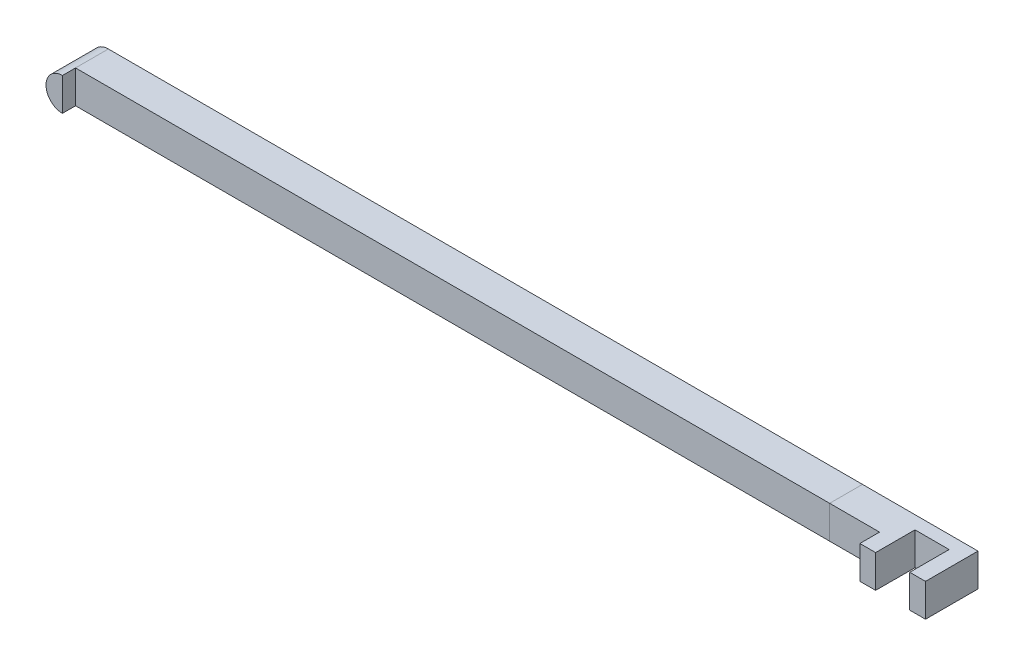
ISO-10303-21;
HEADER;
FILE_DESCRIPTION(('STEP AP214'),'2;1');
FILE_NAME('part.step','',(''),(''),'','','');
FILE_SCHEMA(('AUTOMOTIVE_DESIGN { 1 0 10303 214 1 1 1 1 }'));
ENDSEC;
DATA;
#1=APPLICATION_CONTEXT('core data for automotive mechanical design processes');
#2=APPLICATION_PROTOCOL_DEFINITION('international standard','automotive_design',2000,#1);
#3=PRODUCT_CONTEXT('',#1,'mechanical');
#4=PRODUCT('Part','Part','',(#3));
#5=PRODUCT_RELATED_PRODUCT_CATEGORY('part','',(#4));
#6=PRODUCT_DEFINITION_FORMATION('','',#4);
#7=PRODUCT_DEFINITION_CONTEXT('part definition',#1,'design');
#8=PRODUCT_DEFINITION('design','',#6,#7);
#9=PRODUCT_DEFINITION_SHAPE('','',#8);
#10=(LENGTH_UNIT() NAMED_UNIT(*) SI_UNIT(.MILLI.,.METRE.));
#11=(NAMED_UNIT(*) PLANE_ANGLE_UNIT() SI_UNIT($,.RADIAN.));
#12=(NAMED_UNIT(*) SI_UNIT($,.STERADIAN.) SOLID_ANGLE_UNIT());
#13=UNCERTAINTY_MEASURE_WITH_UNIT(LENGTH_MEASURE(1.E-05),#10,'distance_accuracy_value','');
#14=(GEOMETRIC_REPRESENTATION_CONTEXT(3) GLOBAL_UNCERTAINTY_ASSIGNED_CONTEXT((#13)) GLOBAL_UNIT_ASSIGNED_CONTEXT((#10,
#11,#12)) REPRESENTATION_CONTEXT('',''));
#15=CARTESIAN_POINT('',(0.,0.,0.));
#16=DIRECTION('',(0.,0.,1.));
#17=DIRECTION('',(1.,0.,0.));
#18=AXIS2_PLACEMENT_3D('',#15,#16,#17);
#19=CARTESIAN_POINT('',(54.9,5.,-2.51));
#20=DIRECTION('',(-1.,0.,0.));
#21=DIRECTION('',(0.,0.,1.));
#22=AXIS2_PLACEMENT_3D('',#19,#20,#21);
#23=PLANE('',#22);
#24=DIRECTION('',(0.,0.,-1.));
#25=VECTOR('',#24,1.);
#26=CARTESIAN_POINT('',(54.9,0.,0.));
#27=LINE('',#26,#25);
#28=CARTESIAN_POINT('',(54.9,0.,2.5));
#29=VERTEX_POINT('',#28);
#30=CARTESIAN_POINT('',(54.9,0.,-2.5));
#31=VERTEX_POINT('',#30);
#32=EDGE_CURVE('E138',#29,#31,#27,.T.);
#33=ORIENTED_EDGE('',*,*,#32,.F.);
#34=DIRECTION('',(0.,1.,0.));
#35=VECTOR('',#34,1.);
#36=CARTESIAN_POINT('',(54.9,5.,2.5));
#37=LINE('',#36,#35);
#38=CARTESIAN_POINT('',(54.9,5.,2.5));
#39=VERTEX_POINT('',#38);
#40=EDGE_CURVE('E142',#29,#39,#37,.T.);
#41=ORIENTED_EDGE('',*,*,#40,.T.);
#42=DIRECTION('',(0.,0.,-1.));
#43=VECTOR('',#42,1.);
#44=CARTESIAN_POINT('',(54.9,5.,0.));
#45=LINE('',#44,#43);
#46=CARTESIAN_POINT('',(54.9,5.,-2.5));
#47=VERTEX_POINT('',#46);
#48=EDGE_CURVE('E145',#39,#47,#45,.T.);
#49=ORIENTED_EDGE('',*,*,#48,.T.);
#50=DIRECTION('',(0.,-1.,0.));
#51=VECTOR('',#50,1.);
#52=CARTESIAN_POINT('',(54.9,5.,-2.5));
#53=LINE('',#52,#51);
#54=EDGE_CURVE('E148',#47,#31,#53,.T.);
#55=ORIENTED_EDGE('',*,*,#54,.T.);
#56=EDGE_LOOP('',(#33,#41,#49,#55));
#57=FACE_BOUND('',#56,.T.);
#58=ADVANCED_FACE('F55',(#57),#23,.T.);
#59=CARTESIAN_POINT('',(62.5,5.,2.5));
#60=DIRECTION('',(0.,0.,-1.));
#61=DIRECTION('',(-1.,0.,0.));
#62=AXIS2_PLACEMENT_3D('',#59,#60,#61);
#63=PLANE('',#62);
#64=ORIENTED_EDGE('',*,*,#40,.F.);
#65=DIRECTION('',(1.,0.,0.));
#66=VECTOR('',#65,1.);
#67=CARTESIAN_POINT('',(62.5,0.,2.5));
#68=LINE('',#67,#66);
#69=CARTESIAN_POINT('',(64.9,0.,2.5));
#70=VERTEX_POINT('',#69);
#71=EDGE_CURVE('E59',#29,#70,#68,.T.);
#72=ORIENTED_EDGE('',*,*,#71,.T.);
#73=DIRECTION('',(0.,-1.,0.));
#74=VECTOR('',#73,1.);
#75=CARTESIAN_POINT('',(64.9,5.,2.5));
#76=LINE('',#75,#74);
#77=CARTESIAN_POINT('',(64.9,0.00859696890402346,2.5));
#78=VERTEX_POINT('',#77);
#79=EDGE_CURVE('E180',#78,#70,#76,.T.);
#80=ORIENTED_EDGE('',*,*,#79,.F.);
#81=DIRECTION('',(1.,0.,0.));
#82=VECTOR('',#81,1.);
#83=CARTESIAN_POINT('',(62.5,0.00859696890402346,2.5));
#84=LINE('',#83,#82);
#85=CARTESIAN_POINT('',(62.5,0.00859696890402346,2.5));
#86=VERTEX_POINT('',#85);
#87=EDGE_CURVE('E134',#86,#78,#84,.T.);
#88=ORIENTED_EDGE('',*,*,#87,.F.);
#89=DIRECTION('',(0.,-1.,0.));
#90=VECTOR('',#89,1.);
#91=CARTESIAN_POINT('',(62.5,5.,2.5));
#92=LINE('',#91,#90);
#93=CARTESIAN_POINT('',(62.5,5.,2.5));
#94=VERTEX_POINT('',#93);
#95=EDGE_CURVE('E131',#94,#86,#92,.T.);
#96=ORIENTED_EDGE('',*,*,#95,.F.);
#97=DIRECTION('',(1.,0.,0.));
#98=VECTOR('',#97,1.);
#99=CARTESIAN_POINT('',(62.5,5.,2.5));
#100=LINE('',#99,#98);
#101=EDGE_CURVE('E153',#39,#94,#100,.T.);
#102=ORIENTED_EDGE('',*,*,#101,.F.);
#103=EDGE_LOOP('',(#64,#72,#80,#88,#96,#102));
#104=FACE_BOUND('',#103,.T.);
#105=ADVANCED_FACE('F258',(#104),#63,.F.);
#106=CARTESIAN_POINT('',(0.,5.,0.));
#107=DIRECTION('',(0.,-1.,0.));
#108=DIRECTION('',(0.,0.,-1.));
#109=AXIS2_PLACEMENT_3D('',#106,#107,#108);
#110=PLANE('',#109);
#111=ORIENTED_EDGE('',*,*,#48,.F.);
#112=ORIENTED_EDGE('',*,*,#101,.T.);
#113=DIRECTION('',(0.,0.,-1.));
#114=VECTOR('',#113,1.);
#115=CARTESIAN_POINT('',(62.5,5.,5.5));
#116=LINE('',#115,#114);
#117=CARTESIAN_POINT('',(62.5,5.,5.5));
#118=VERTEX_POINT('',#117);
#119=EDGE_CURVE('E197',#118,#94,#116,.T.);
#120=ORIENTED_EDGE('',*,*,#119,.F.);
#121=DIRECTION('',(-1.,0.,0.));
#122=VECTOR('',#121,1.);
#123=CARTESIAN_POINT('',(62.5,5.,5.5));
#124=LINE('',#123,#122);
#125=CARTESIAN_POINT('',(64.9,5.,5.5));
#126=VERTEX_POINT('',#125);
#127=EDGE_CURVE('E74',#126,#118,#124,.T.);
#128=ORIENTED_EDGE('',*,*,#127,.F.);
#129=DIRECTION('',(0.,0.,1.));
#130=VECTOR('',#129,1.);
#131=CARTESIAN_POINT('',(64.9,5.,-0.5));
#132=LINE('',#131,#130);
#133=CARTESIAN_POINT('',(64.9,5.,-0.5));
#134=VERTEX_POINT('',#133);
#135=EDGE_CURVE('E177',#134,#126,#132,.T.);
#136=ORIENTED_EDGE('',*,*,#135,.F.);
#137=DIRECTION('',(1.,0.,0.));
#138=VECTOR('',#137,1.);
#139=CARTESIAN_POINT('',(64.9,5.,-0.5));
#140=LINE('',#139,#138);
#141=CARTESIAN_POINT('',(70.1,5.,-0.5));
#142=VERTEX_POINT('',#141);
#143=EDGE_CURVE('E182',#134,#142,#140,.T.);
#144=ORIENTED_EDGE('',*,*,#143,.T.);
#145=DIRECTION('',(0.,0.,1.));
#146=VECTOR('',#145,1.);
#147=CARTESIAN_POINT('',(70.1,5.,-0.5));
#148=LINE('',#147,#146);
#149=CARTESIAN_POINT('',(70.1,5.,5.5));
#150=VERTEX_POINT('',#149);
#151=EDGE_CURVE('E117',#142,#150,#148,.T.);
#152=ORIENTED_EDGE('',*,*,#151,.T.);
#153=DIRECTION('',(-1.,0.,0.));
#154=VECTOR('',#153,1.);
#155=CARTESIAN_POINT('',(70.1,5.,5.5));
#156=LINE('',#155,#154);
#157=CARTESIAN_POINT('',(72.5,5.,5.5));
#158=VERTEX_POINT('',#157);
#159=EDGE_CURVE('E130',#158,#150,#156,.T.);
#160=ORIENTED_EDGE('',*,*,#159,.F.);
#161=DIRECTION('',(0.,0.,1.));
#162=VECTOR('',#161,1.);
#163=CARTESIAN_POINT('',(72.5,5.,2.5));
#164=LINE('',#163,#162);
#165=CARTESIAN_POINT('',(72.5,5.,-2.5));
#166=VERTEX_POINT('',#165);
#167=EDGE_CURVE('E161',#166,#158,#164,.T.);
#168=ORIENTED_EDGE('',*,*,#167,.F.);
#169=DIRECTION('',(-1.,0.,0.));
#170=VECTOR('',#169,1.);
#171=CARTESIAN_POINT('',(62.5,5.,-2.5));
#172=LINE('',#171,#170);
#173=EDGE_CURVE('E141',#166,#47,#172,.T.);
#174=ORIENTED_EDGE('',*,*,#173,.T.);
#175=EDGE_LOOP('',(#111,#112,#120,#128,#136,#144,#152,#160,#168,#174));
#176=FACE_BOUND('',#175,.T.);
#177=ADVANCED_FACE('F207',(#176),#110,.F.);
#178=CARTESIAN_POINT('',(0.,0.,0.));
#179=DIRECTION('',(0.,-1.,0.));
#180=DIRECTION('',(0.,0.,-1.));
#181=AXIS2_PLACEMENT_3D('',#178,#179,#180);
#182=PLANE('',#181);
#183=ORIENTED_EDGE('',*,*,#71,.F.);
#184=ORIENTED_EDGE('',*,*,#32,.T.);
#185=DIRECTION('',(-1.,0.,0.));
#186=VECTOR('',#185,1.);
#187=CARTESIAN_POINT('',(62.5,0.,-2.5));
#188=LINE('',#187,#186);
#189=CARTESIAN_POINT('',(72.5,0.,-2.5));
#190=VERTEX_POINT('',#189);
#191=EDGE_CURVE('E154',#190,#31,#188,.T.);
#192=ORIENTED_EDGE('',*,*,#191,.F.);
#193=DIRECTION('',(0.,0.,-1.));
#194=VECTOR('',#193,1.);
#195=CARTESIAN_POINT('',(72.5,0.,2.5));
#196=LINE('',#195,#194);
#197=CARTESIAN_POINT('',(72.5,0.,5.5));
#198=VERTEX_POINT('',#197);
#199=EDGE_CURVE('E99',#198,#190,#196,.T.);
#200=ORIENTED_EDGE('',*,*,#199,.F.);
#201=DIRECTION('',(1.,0.,0.));
#202=VECTOR('',#201,1.);
#203=CARTESIAN_POINT('',(70.1,0.,5.5));
#204=LINE('',#203,#202);
#205=CARTESIAN_POINT('',(70.1,0.,5.5));
#206=VERTEX_POINT('',#205);
#207=EDGE_CURVE('E119',#206,#198,#204,.T.);
#208=ORIENTED_EDGE('',*,*,#207,.F.);
#209=DIRECTION('',(0.,0.,1.));
#210=VECTOR('',#209,1.);
#211=CARTESIAN_POINT('',(70.1,0.,-0.5));
#212=LINE('',#211,#210);
#213=CARTESIAN_POINT('',(70.1,0.,-0.5));
#214=VERTEX_POINT('',#213);
#215=EDGE_CURVE('E106',#214,#206,#212,.T.);
#216=ORIENTED_EDGE('',*,*,#215,.F.);
#217=DIRECTION('',(1.,0.,0.));
#218=VECTOR('',#217,1.);
#219=CARTESIAN_POINT('',(64.9,0.,-0.5));
#220=LINE('',#219,#218);
#221=CARTESIAN_POINT('',(64.9,0.,-0.5));
#222=VERTEX_POINT('',#221);
#223=EDGE_CURVE('E185',#222,#214,#220,.T.);
#224=ORIENTED_EDGE('',*,*,#223,.F.);
#225=DIRECTION('',(0.,0.,1.));
#226=VECTOR('',#225,1.);
#227=CARTESIAN_POINT('',(64.9,0.,-0.5));
#228=LINE('',#227,#226);
#229=EDGE_CURVE('E116',#222,#70,#228,.T.);
#230=ORIENTED_EDGE('',*,*,#229,.T.);
#231=EDGE_LOOP('',(#183,#184,#192,#200,#208,#216,#224,#230));
#232=FACE_BOUND('',#231,.T.);
#233=ADVANCED_FACE('F121',(#232),#182,.T.);
#234=CARTESIAN_POINT('',(62.5,5.,-2.5));
#235=DIRECTION('',(0.,0.,1.));
#236=DIRECTION('',(1.,0.,0.));
#237=AXIS2_PLACEMENT_3D('',#234,#235,#236);
#238=PLANE('',#237);
#239=ORIENTED_EDGE('',*,*,#54,.F.);
#240=ORIENTED_EDGE('',*,*,#173,.F.);
#241=DIRECTION('',(0.,1.,0.));
#242=VECTOR('',#241,1.);
#243=CARTESIAN_POINT('',(72.5,0.,-2.5));
#244=LINE('',#243,#242);
#245=EDGE_CURVE('E166',#190,#166,#244,.T.);
#246=ORIENTED_EDGE('',*,*,#245,.F.);
#247=ORIENTED_EDGE('',*,*,#191,.T.);
#248=EDGE_LOOP('',(#239,#240,#246,#247));
#249=FACE_BOUND('',#248,.T.);
#250=ADVANCED_FACE('F57',(#249),#238,.F.);
#251=CARTESIAN_POINT('',(72.5,0.,0.));
#252=DIRECTION('',(1.,0.,0.));
#253=DIRECTION('',(0.,0.,-1.));
#254=AXIS2_PLACEMENT_3D('',#251,#252,#253);
#255=PLANE('',#254);
#256=ORIENTED_EDGE('',*,*,#199,.T.);
#257=ORIENTED_EDGE('',*,*,#245,.T.);
#258=ORIENTED_EDGE('',*,*,#167,.T.);
#259=DIRECTION('',(0.,1.,0.));
#260=VECTOR('',#259,1.);
#261=CARTESIAN_POINT('',(72.5,5.,5.5));
#262=LINE('',#261,#260);
#263=EDGE_CURVE('E125',#198,#158,#262,.T.);
#264=ORIENTED_EDGE('',*,*,#263,.F.);
#265=EDGE_LOOP('',(#256,#257,#258,#264));
#266=FACE_BOUND('',#265,.T.);
#267=ADVANCED_FACE('F251',(#266),#255,.T.);
#268=CARTESIAN_POINT('',(70.1,5.,-0.5));
#269=DIRECTION('',(-1.,0.,0.));
#270=DIRECTION('',(0.,0.,1.));
#271=AXIS2_PLACEMENT_3D('',#268,#269,#270);
#272=PLANE('',#271);
#273=ORIENTED_EDGE('',*,*,#215,.T.);
#274=DIRECTION('',(0.,-1.,0.));
#275=VECTOR('',#274,1.);
#276=CARTESIAN_POINT('',(70.1,5.,5.5));
#277=LINE('',#276,#275);
#278=EDGE_CURVE('E110',#150,#206,#277,.T.);
#279=ORIENTED_EDGE('',*,*,#278,.F.);
#280=ORIENTED_EDGE('',*,*,#151,.F.);
#281=DIRECTION('',(0.,-1.,0.));
#282=VECTOR('',#281,1.);
#283=CARTESIAN_POINT('',(70.1,5.,-0.5));
#284=LINE('',#283,#282);
#285=EDGE_CURVE('E113',#142,#214,#284,.T.);
#286=ORIENTED_EDGE('',*,*,#285,.T.);
#287=EDGE_LOOP('',(#273,#279,#280,#286));
#288=FACE_BOUND('',#287,.T.);
#289=ADVANCED_FACE('F107',(#288),#272,.T.);
#290=CARTESIAN_POINT('',(64.9,5.,-0.5));
#291=DIRECTION('',(-1.,0.,0.));
#292=DIRECTION('',(0.,0.,1.));
#293=AXIS2_PLACEMENT_3D('',#290,#291,#292);
#294=PLANE('',#293);
#295=ORIENTED_EDGE('',*,*,#135,.T.);
#296=DIRECTION('',(0.,1.,0.));
#297=VECTOR('',#296,1.);
#298=CARTESIAN_POINT('',(64.9,5.,5.5));
#299=LINE('',#298,#297);
#300=CARTESIAN_POINT('',(64.9,0.00859696890402346,5.5));
#301=VERTEX_POINT('',#300);
#302=EDGE_CURVE('E195',#301,#126,#299,.T.);
#303=ORIENTED_EDGE('',*,*,#302,.F.);
#304=DIRECTION('',(0.,0.,-1.));
#305=VECTOR('',#304,1.);
#306=CARTESIAN_POINT('',(64.9,0.00859696890402346,5.5));
#307=LINE('',#306,#305);
#308=EDGE_CURVE('E65',#301,#78,#307,.T.);
#309=ORIENTED_EDGE('',*,*,#308,.T.);
#310=ORIENTED_EDGE('',*,*,#79,.T.);
#311=ORIENTED_EDGE('',*,*,#229,.F.);
#312=DIRECTION('',(0.,-1.,0.));
#313=VECTOR('',#312,1.);
#314=CARTESIAN_POINT('',(64.9,5.,-0.5));
#315=LINE('',#314,#313);
#316=EDGE_CURVE('E179',#134,#222,#315,.T.);
#317=ORIENTED_EDGE('',*,*,#316,.F.);
#318=EDGE_LOOP('',(#295,#303,#309,#310,#311,#317));
#319=FACE_BOUND('',#318,.T.);
#320=ADVANCED_FACE('F230',(#319),#294,.F.);
#321=CARTESIAN_POINT('',(0.,0.,-0.5));
#322=DIRECTION('',(0.,0.,-1.));
#323=DIRECTION('',(-1.,0.,0.));
#324=AXIS2_PLACEMENT_3D('',#321,#322,#323);
#325=PLANE('',#324);
#326=ORIENTED_EDGE('',*,*,#143,.F.);
#327=ORIENTED_EDGE('',*,*,#316,.T.);
#328=ORIENTED_EDGE('',*,*,#223,.T.);
#329=ORIENTED_EDGE('',*,*,#285,.F.);
#330=EDGE_LOOP('',(#326,#327,#328,#329));
#331=FACE_BOUND('',#330,.T.);
#332=ADVANCED_FACE('F272',(#331),#325,.F.);
#333=CARTESIAN_POINT('',(62.5,5.,5.5));
#334=DIRECTION('',(1.,0.,0.));
#335=DIRECTION('',(0.,0.,-1.));
#336=AXIS2_PLACEMENT_3D('',#333,#334,#335);
#337=PLANE('',#336);
#338=ORIENTED_EDGE('',*,*,#95,.T.);
#339=DIRECTION('',(0.,0.,-1.));
#340=VECTOR('',#339,1.);
#341=CARTESIAN_POINT('',(62.5,0.00859696890402346,5.5));
#342=LINE('',#341,#340);
#343=CARTESIAN_POINT('',(62.5,0.00859696890402346,5.5));
#344=VERTEX_POINT('',#343);
#345=EDGE_CURVE('E12',#344,#86,#342,.T.);
#346=ORIENTED_EDGE('',*,*,#345,.F.);
#347=DIRECTION('',(0.,-1.,0.));
#348=VECTOR('',#347,1.);
#349=CARTESIAN_POINT('',(62.5,5.,5.5));
#350=LINE('',#349,#348);
#351=EDGE_CURVE('E190',#118,#344,#350,.T.);
#352=ORIENTED_EDGE('',*,*,#351,.F.);
#353=ORIENTED_EDGE('',*,*,#119,.T.);
#354=EDGE_LOOP('',(#338,#346,#352,#353));
#355=FACE_BOUND('',#354,.T.);
#356=ADVANCED_FACE('F269',(#355),#337,.F.);
#357=CARTESIAN_POINT('',(62.5,0.00859696890402346,5.5));
#358=DIRECTION('',(0.,1.,0.));
#359=DIRECTION('',(0.,0.,1.));
#360=AXIS2_PLACEMENT_3D('',#357,#358,#359);
#361=PLANE('',#360);
#362=ORIENTED_EDGE('',*,*,#87,.T.);
#363=ORIENTED_EDGE('',*,*,#308,.F.);
#364=DIRECTION('',(1.,0.,0.));
#365=VECTOR('',#364,1.);
#366=CARTESIAN_POINT('',(62.5,0.00859696890402346,5.5));
#367=LINE('',#366,#365);
#368=EDGE_CURVE('E192',#344,#301,#367,.T.);
#369=ORIENTED_EDGE('',*,*,#368,.F.);
#370=ORIENTED_EDGE('',*,*,#345,.T.);
#371=EDGE_LOOP('',(#362,#363,#369,#370));
#372=FACE_BOUND('',#371,.T.);
#373=ADVANCED_FACE('F226',(#372),#361,.F.);
#374=CARTESIAN_POINT('',(0.,0.,5.5));
#375=DIRECTION('',(0.,0.,1.));
#376=DIRECTION('',(1.,0.,0.));
#377=AXIS2_PLACEMENT_3D('',#374,#375,#376);
#378=PLANE('',#377);
#379=ORIENTED_EDGE('',*,*,#351,.T.);
#380=ORIENTED_EDGE('',*,*,#368,.T.);
#381=ORIENTED_EDGE('',*,*,#302,.T.);
#382=ORIENTED_EDGE('',*,*,#127,.T.);
#383=EDGE_LOOP('',(#379,#380,#381,#382));
#384=FACE_BOUND('',#383,.T.);
#385=ADVANCED_FACE('F221',(#384),#378,.T.);
#386=CARTESIAN_POINT('',(0.,0.,5.5));
#387=DIRECTION('',(0.,0.,1.));
#388=DIRECTION('',(1.,0.,0.));
#389=AXIS2_PLACEMENT_3D('',#386,#387,#388);
#390=PLANE('',#389);
#391=ORIENTED_EDGE('',*,*,#278,.T.);
#392=ORIENTED_EDGE('',*,*,#207,.T.);
#393=ORIENTED_EDGE('',*,*,#263,.T.);
#394=ORIENTED_EDGE('',*,*,#159,.T.);
#395=EDGE_LOOP('',(#391,#392,#393,#394));
#396=FACE_BOUND('',#395,.T.);
#397=ADVANCED_FACE('F128',(#396),#390,.T.);
#398=CLOSED_SHELL('',(#58,#105,#177,#233,#250,#267,#289,#320,#332,#356,#373,#385,#397));
#399=MANIFOLD_SOLID_BREP('B2',#398);
#400=CARTESIAN_POINT('',(54.9,5.,-2.51));
#401=DIRECTION('',(-1.,0.,0.));
#402=DIRECTION('',(0.,0.,1.));
#403=AXIS2_PLACEMENT_3D('',#400,#401,#402);
#404=PLANE('',#403);
#405=DIRECTION('',(0.,0.,-1.));
#406=VECTOR('',#405,1.);
#407=CARTESIAN_POINT('',(54.9,0.,0.));
#408=LINE('',#407,#406);
#409=CARTESIAN_POINT('',(54.9,0.,2.5));
#410=VERTEX_POINT('',#409);
#411=CARTESIAN_POINT('',(54.9,0.,-2.5));
#412=VERTEX_POINT('',#411);
#413=EDGE_CURVE('E53',#410,#412,#408,.T.);
#414=ORIENTED_EDGE('',*,*,#413,.T.);
#415=DIRECTION('',(0.,-1.,0.));
#416=VECTOR('',#415,1.);
#417=CARTESIAN_POINT('',(54.9,5.,-2.5));
#418=LINE('',#417,#416);
#419=CARTESIAN_POINT('',(54.9,5.,-2.5));
#420=VERTEX_POINT('',#419);
#421=EDGE_CURVE('E498',#420,#412,#418,.T.);
#422=ORIENTED_EDGE('',*,*,#421,.F.);
#423=DIRECTION('',(0.,0.,-1.));
#424=VECTOR('',#423,1.);
#425=CARTESIAN_POINT('',(54.9,5.,0.));
#426=LINE('',#425,#424);
#427=CARTESIAN_POINT('',(54.9,5.,2.5));
#428=VERTEX_POINT('',#427);
#429=EDGE_CURVE('E501',#428,#420,#426,.T.);
#430=ORIENTED_EDGE('',*,*,#429,.F.);
#431=DIRECTION('',(0.,1.,0.));
#432=VECTOR('',#431,1.);
#433=CARTESIAN_POINT('',(54.9,5.,2.5));
#434=LINE('',#433,#432);
#435=EDGE_CURVE('E392',#410,#428,#434,.T.);
#436=ORIENTED_EDGE('',*,*,#435,.F.);
#437=EDGE_LOOP('',(#414,#422,#430,#436));
#438=FACE_BOUND('',#437,.T.);
#439=ADVANCED_FACE('F389',(#438),#404,.F.);
#440=CARTESIAN_POINT('',(-60.,2.5,4.5));
#441=DIRECTION('',(0.,0.,1.));
#442=DIRECTION('',(1.,0.,0.));
#443=AXIS2_PLACEMENT_3D('',#440,#441,#442);
#444=PLANE('',#443);
#445=CARTESIAN_POINT('',(-60.,2.5,4.5));
#446=DIRECTION('',(0.,0.,1.));
#447=DIRECTION('',(1.,0.,0.));
#448=AXIS2_PLACEMENT_3D('',#445,#446,#447);
#449=CIRCLE('',#448,2.5);
#450=CARTESIAN_POINT('',(-60.,5.,4.5));
#451=VERTEX_POINT('',#450);
#452=CARTESIAN_POINT('',(-60.,0.,4.5));
#453=VERTEX_POINT('',#452);
#454=EDGE_CURVE('E452',#451,#453,#449,.T.);
#455=ORIENTED_EDGE('',*,*,#454,.T.);
#456=DIRECTION('',(0.,1.,0.));
#457=VECTOR('',#456,1.);
#458=CARTESIAN_POINT('',(-60.,0.,4.5));
#459=LINE('',#458,#457);
#460=EDGE_CURVE('E441',#453,#451,#459,.T.);
#461=ORIENTED_EDGE('',*,*,#460,.T.);
#462=EDGE_LOOP('',(#455,#461));
#463=FACE_BOUND('',#462,.T.);
#464=ADVANCED_FACE('F454',(#463),#444,.T.);
#465=CARTESIAN_POINT('',(-60.,0.,4.5));
#466=DIRECTION('',(-1.,0.,0.));
#467=DIRECTION('',(0.,0.,1.));
#468=AXIS2_PLACEMENT_3D('',#465,#466,#467);
#469=PLANE('',#468);
#470=DIRECTION('',(0.,1.,0.));
#471=VECTOR('',#470,1.);
#472=CARTESIAN_POINT('',(-60.,0.,2.5));
#473=LINE('',#472,#471);
#474=CARTESIAN_POINT('',(-60.,0.,2.5));
#475=VERTEX_POINT('',#474);
#476=CARTESIAN_POINT('',(-60.,5.,2.5));
#477=VERTEX_POINT('',#476);
#478=EDGE_CURVE('E457',#475,#477,#473,.T.);
#479=ORIENTED_EDGE('',*,*,#478,.T.);
#480=DIRECTION('',(0.,0.,-1.));
#481=VECTOR('',#480,1.);
#482=CARTESIAN_POINT('',(-60.,5.,4.5));
#483=LINE('',#482,#481);
#484=EDGE_CURVE('E448',#451,#477,#483,.T.);
#485=ORIENTED_EDGE('',*,*,#484,.F.);
#486=ORIENTED_EDGE('',*,*,#460,.F.);
#487=DIRECTION('',(0.,0.,-1.));
#488=VECTOR('',#487,1.);
#489=CARTESIAN_POINT('',(-60.,0.,4.5));
#490=LINE('',#489,#488);
#491=EDGE_CURVE('E446',#453,#475,#490,.T.);
#492=ORIENTED_EDGE('',*,*,#491,.T.);
#493=EDGE_LOOP('',(#479,#485,#486,#492));
#494=FACE_BOUND('',#493,.T.);
#495=ADVANCED_FACE('F444',(#494),#469,.F.);
#496=CARTESIAN_POINT('',(62.5,5.,2.5));
#497=DIRECTION('',(0.,0.,-1.));
#498=DIRECTION('',(-1.,0.,0.));
#499=AXIS2_PLACEMENT_3D('',#496,#497,#498);
#500=PLANE('',#499);
#501=DIRECTION('',(1.,0.,0.));
#502=VECTOR('',#501,1.);
#503=CARTESIAN_POINT('',(62.5,0.,2.5));
#504=LINE('',#503,#502);
#505=EDGE_CURVE('E470',#475,#410,#504,.T.);
#506=ORIENTED_EDGE('',*,*,#505,.T.);
#507=ORIENTED_EDGE('',*,*,#435,.T.);
#508=DIRECTION('',(1.,0.,0.));
#509=VECTOR('',#508,1.);
#510=CARTESIAN_POINT('',(62.5,5.,2.5));
#511=LINE('',#510,#509);
#512=EDGE_CURVE('E475',#477,#428,#511,.T.);
#513=ORIENTED_EDGE('',*,*,#512,.F.);
#514=ORIENTED_EDGE('',*,*,#478,.F.);
#515=EDGE_LOOP('',(#506,#507,#513,#514));
#516=FACE_BOUND('',#515,.T.);
#517=ADVANCED_FACE('F513',(#516),#500,.F.);
#518=CARTESIAN_POINT('',(-60.,2.5,-2.5));
#519=DIRECTION('',(0.,0.,-1.));
#520=DIRECTION('',(-1.,0.,0.));
#521=AXIS2_PLACEMENT_3D('',#518,#519,#520);
#522=CYLINDRICAL_SURFACE('',#521,2.5);
#523=DIRECTION('',(0.,0.,1.));
#524=VECTOR('',#523,1.);
#525=CARTESIAN_POINT('',(-62.5,2.5,2.5));
#526=LINE('',#525,#524);
#527=CARTESIAN_POINT('',(-62.5,2.5,-2.5));
#528=VERTEX_POINT('',#527);
#529=CARTESIAN_POINT('',(-62.5,2.5,2.5));
#530=VERTEX_POINT('',#529);
#531=EDGE_CURVE('E466',#528,#530,#526,.T.);
#532=ORIENTED_EDGE('',*,*,#531,.F.);
#533=CARTESIAN_POINT('',(-60.,2.5,-2.5));
#534=DIRECTION('',(0.,0.,1.));
#535=DIRECTION('',(1.,0.,0.));
#536=AXIS2_PLACEMENT_3D('',#533,#534,#535);
#537=CIRCLE('',#536,2.5);
#538=CARTESIAN_POINT('',(-60.,0.,-2.5));
#539=VERTEX_POINT('',#538);
#540=EDGE_CURVE('E490',#539,#528,#537,.F.);
#541=ORIENTED_EDGE('',*,*,#540,.F.);
#542=DIRECTION('',(0.,0.,1.));
#543=VECTOR('',#542,1.);
#544=CARTESIAN_POINT('',(-60.,0.,-2.5));
#545=LINE('',#544,#543);
#546=EDGE_CURVE('E464',#475,#539,#545,.F.);
#547=ORIENTED_EDGE('',*,*,#546,.F.);
#548=ORIENTED_EDGE('',*,*,#491,.F.);
#549=ORIENTED_EDGE('',*,*,#454,.F.);
#550=ORIENTED_EDGE('',*,*,#484,.T.);
#551=DIRECTION('',(0.,0.,1.));
#552=VECTOR('',#551,1.);
#553=CARTESIAN_POINT('',(-60.,5.,0.));
#554=LINE('',#553,#552);
#555=CARTESIAN_POINT('',(-60.,5.,-2.5));
#556=VERTEX_POINT('',#555);
#557=EDGE_CURVE('E483',#556,#477,#554,.T.);
#558=ORIENTED_EDGE('',*,*,#557,.F.);
#559=CARTESIAN_POINT('',(-60.,2.5,-2.5));
#560=DIRECTION('',(0.,0.,1.));
#561=DIRECTION('',(1.,0.,0.));
#562=AXIS2_PLACEMENT_3D('',#559,#560,#561);
#563=CIRCLE('',#562,2.5);
#564=EDGE_CURVE('E493',#528,#556,#563,.F.);
#565=ORIENTED_EDGE('',*,*,#564,.F.);
#566=ORIENTED_EDGE('',*,*,#531,.T.);
#567=EDGE_LOOP('',(#532,#541,#547,#548,#549,#550,#558,#565,#566));
#568=FACE_BOUND('',#567,.T.);
#569=ADVANCED_FACE('F461',(#568),#522,.T.);
#570=CARTESIAN_POINT('',(0.,0.,0.));
#571=DIRECTION('',(0.,-1.,0.));
#572=DIRECTION('',(0.,0.,-1.));
#573=AXIS2_PLACEMENT_3D('',#570,#571,#572);
#574=PLANE('',#573);
#575=ORIENTED_EDGE('',*,*,#413,.F.);
#576=ORIENTED_EDGE('',*,*,#505,.F.);
#577=ORIENTED_EDGE('',*,*,#546,.T.);
#578=DIRECTION('',(-1.,0.,0.));
#579=VECTOR('',#578,1.);
#580=CARTESIAN_POINT('',(62.5,0.,-2.5));
#581=LINE('',#580,#579);
#582=EDGE_CURVE('E480',#412,#539,#581,.T.);
#583=ORIENTED_EDGE('',*,*,#582,.F.);
#584=EDGE_LOOP('',(#575,#576,#577,#583));
#585=FACE_BOUND('',#584,.T.);
#586=ADVANCED_FACE('F517',(#585),#574,.T.);
#587=CARTESIAN_POINT('',(0.,5.,0.));
#588=DIRECTION('',(0.,-1.,0.));
#589=DIRECTION('',(0.,0.,-1.));
#590=AXIS2_PLACEMENT_3D('',#587,#588,#589);
#591=PLANE('',#590);
#592=ORIENTED_EDGE('',*,*,#512,.T.);
#593=ORIENTED_EDGE('',*,*,#429,.T.);
#594=DIRECTION('',(-1.,0.,0.));
#595=VECTOR('',#594,1.);
#596=CARTESIAN_POINT('',(62.5,5.,-2.5));
#597=LINE('',#596,#595);
#598=EDGE_CURVE('E479',#420,#556,#597,.T.);
#599=ORIENTED_EDGE('',*,*,#598,.T.);
#600=ORIENTED_EDGE('',*,*,#557,.T.);
#601=EDGE_LOOP('',(#592,#593,#599,#600));
#602=FACE_BOUND('',#601,.T.);
#603=ADVANCED_FACE('F506',(#602),#591,.F.);
#604=CARTESIAN_POINT('',(62.5,5.,-2.5));
#605=DIRECTION('',(0.,0.,1.));
#606=DIRECTION('',(1.,0.,0.));
#607=AXIS2_PLACEMENT_3D('',#604,#605,#606);
#608=PLANE('',#607);
#609=ORIENTED_EDGE('',*,*,#598,.F.);
#610=ORIENTED_EDGE('',*,*,#421,.T.);
#611=ORIENTED_EDGE('',*,*,#582,.T.);
#612=ORIENTED_EDGE('',*,*,#540,.T.);
#613=ORIENTED_EDGE('',*,*,#564,.T.);
#614=EDGE_LOOP('',(#609,#610,#611,#612,#613));
#615=FACE_BOUND('',#614,.T.);
#616=ADVANCED_FACE('F510',(#615),#608,.F.);
#617=CLOSED_SHELL('',(#439,#464,#495,#517,#569,#586,#603,#616));
#618=MANIFOLD_SOLID_BREP('B6',#617);
#619=ADVANCED_BREP_SHAPE_REPRESENTATION('',(#18,#399,#618),#14);
#620=SHAPE_DEFINITION_REPRESENTATION(#9,#619);
ENDSEC;
END-ISO-10303-21;
